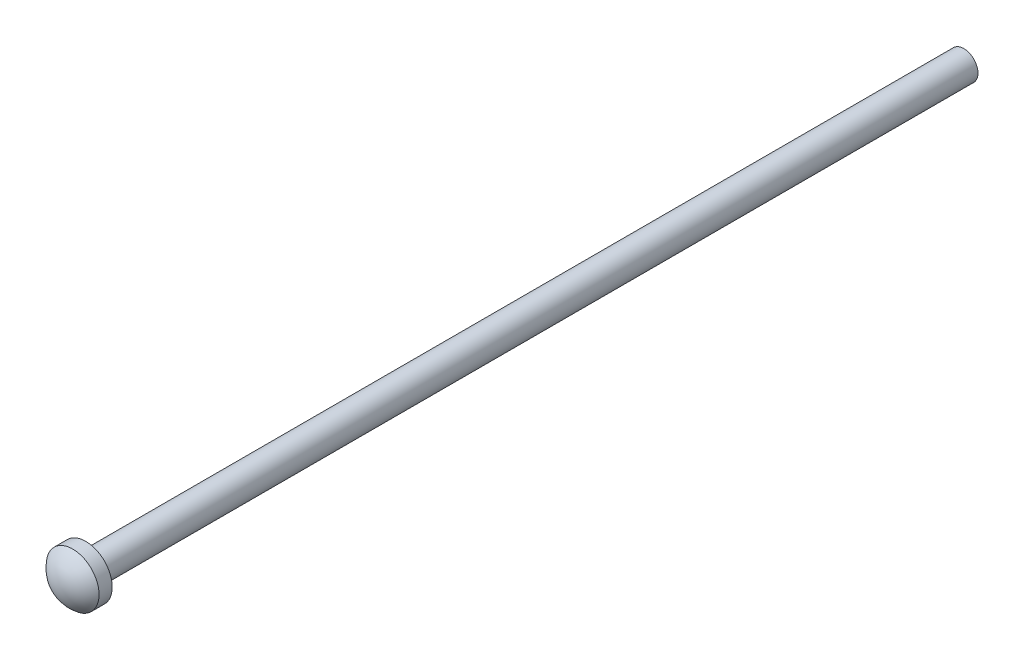
ISO-10303-21;
HEADER;
FILE_DESCRIPTION(('STEP AP214'),'2;1');
FILE_NAME('part.step','',(''),(''),'','','');
FILE_SCHEMA(('AUTOMOTIVE_DESIGN { 1 0 10303 214 1 1 1 1 }'));
ENDSEC;
DATA;
#1=APPLICATION_CONTEXT('core data for automotive mechanical design processes');
#2=APPLICATION_PROTOCOL_DEFINITION('international standard','automotive_design',2000,#1);
#3=PRODUCT_CONTEXT('',#1,'mechanical');
#4=PRODUCT('Part','Part','',(#3));
#5=PRODUCT_RELATED_PRODUCT_CATEGORY('part','',(#4));
#6=PRODUCT_DEFINITION_FORMATION('','',#4);
#7=PRODUCT_DEFINITION_CONTEXT('part definition',#1,'design');
#8=PRODUCT_DEFINITION('design','',#6,#7);
#9=PRODUCT_DEFINITION_SHAPE('','',#8);
#10=(LENGTH_UNIT() NAMED_UNIT(*) SI_UNIT(.MILLI.,.METRE.));
#11=(NAMED_UNIT(*) PLANE_ANGLE_UNIT() SI_UNIT($,.RADIAN.));
#12=(NAMED_UNIT(*) SI_UNIT($,.STERADIAN.) SOLID_ANGLE_UNIT());
#13=UNCERTAINTY_MEASURE_WITH_UNIT(LENGTH_MEASURE(1.E-05),#10,'distance_accuracy_value','');
#14=(GEOMETRIC_REPRESENTATION_CONTEXT(3) GLOBAL_UNCERTAINTY_ASSIGNED_CONTEXT((#13)) GLOBAL_UNIT_ASSIGNED_CONTEXT((#10,
#11,#12)) REPRESENTATION_CONTEXT('',''));
#15=CARTESIAN_POINT('',(0.,0.,0.));
#16=DIRECTION('',(0.,0.,1.));
#17=DIRECTION('',(1.,0.,0.));
#18=AXIS2_PLACEMENT_3D('',#15,#16,#17);
#19=CARTESIAN_POINT('',(0.,60.,-200.));
#20=DIRECTION('',(0.,0.,1.));
#21=DIRECTION('',(1.,0.,0.));
#22=AXIS2_PLACEMENT_3D('',#19,#20,#21);
#23=CYLINDRICAL_SURFACE('',#22,3.25);
#24=CARTESIAN_POINT('',(0.,60.,-200.));
#25=DIRECTION('',(0.,0.,1.));
#26=DIRECTION('',(1.,0.,0.));
#27=AXIS2_PLACEMENT_3D('',#24,#25,#26);
#28=CIRCLE('',#27,3.25);
#29=CARTESIAN_POINT('',(3.25,60.,-200.));
#30=VERTEX_POINT('',#29);
#31=EDGE_CURVE('E10',#30,#30,#28,.T.);
#32=ORIENTED_EDGE('',*,*,#31,.T.);
#33=EDGE_LOOP('',(#32));
#34=FACE_BOUND('',#33,.T.);
#35=CARTESIAN_POINT('',(0.,60.,0.));
#36=DIRECTION('',(0.,0.,1.));
#37=DIRECTION('',(1.,0.,0.));
#38=AXIS2_PLACEMENT_3D('',#35,#36,#37);
#39=CIRCLE('',#38,3.25);
#40=CARTESIAN_POINT('',(3.25,60.,0.));
#41=VERTEX_POINT('',#40);
#42=EDGE_CURVE('E38',#41,#41,#39,.T.);
#43=ORIENTED_EDGE('',*,*,#42,.F.);
#44=EDGE_LOOP('',(#43));
#45=FACE_BOUND('',#44,.T.);
#46=ADVANCED_FACE('F30',(#34,#45),#23,.T.);
#47=CARTESIAN_POINT('',(0.,60.,-200.));
#48=DIRECTION('',(0.,0.,1.));
#49=DIRECTION('',(1.,0.,0.));
#50=AXIS2_PLACEMENT_3D('',#47,#48,#49);
#51=PLANE('',#50);
#52=ORIENTED_EDGE('',*,*,#31,.F.);
#53=EDGE_LOOP('',(#52));
#54=FACE_BOUND('',#53,.T.);
#55=ADVANCED_FACE('F54',(#54),#51,.F.);
#56=CARTESIAN_POINT('',(0.,60.,3.));
#57=DIRECTION('',(0.,0.,-1.));
#58=DIRECTION('',(-1.,0.,0.));
#59=AXIS2_PLACEMENT_3D('',#56,#57,#58);
#60=CYLINDRICAL_SURFACE('',#59,6.);
#61=CARTESIAN_POINT('',(0.,60.,3.));
#62=DIRECTION('',(0.,0.,1.));
#63=DIRECTION('',(1.,0.,0.));
#64=AXIS2_PLACEMENT_3D('',#61,#62,#63);
#65=CIRCLE('',#64,6.);
#66=CARTESIAN_POINT('',(6.,60.,3.));
#67=VERTEX_POINT('',#66);
#68=EDGE_CURVE('E34',#67,#67,#65,.T.);
#69=ORIENTED_EDGE('',*,*,#68,.F.);
#70=EDGE_LOOP('',(#69));
#71=FACE_BOUND('',#70,.T.);
#72=CARTESIAN_POINT('',(0.,60.,0.));
#73=DIRECTION('',(0.,0.,1.));
#74=DIRECTION('',(1.,0.,0.));
#75=AXIS2_PLACEMENT_3D('',#72,#73,#74);
#76=CIRCLE('',#75,6.);
#77=CARTESIAN_POINT('',(6.,60.,0.));
#78=VERTEX_POINT('',#77);
#79=EDGE_CURVE('E44',#78,#78,#76,.T.);
#80=ORIENTED_EDGE('',*,*,#79,.T.);
#81=EDGE_LOOP('',(#80));
#82=FACE_BOUND('',#81,.T.);
#83=ADVANCED_FACE('F52',(#71,#82),#60,.T.);
#84=CARTESIAN_POINT('',(0.,60.,-1.5));
#85=DIRECTION('',(0.,0.,1.));
#86=DIRECTION('',(1.,0.,0.));
#87=AXIS2_PLACEMENT_3D('',#84,#85,#86);
#88=SPHERICAL_SURFACE('',#87,7.5);
#89=ORIENTED_EDGE('',*,*,#68,.T.);
#90=EDGE_LOOP('',(#89));
#91=FACE_BOUND('',#90,.T.);
#92=ADVANCED_FACE('F32',(#91),#88,.T.);
#93=CARTESIAN_POINT('',(0.,60.,0.));
#94=DIRECTION('',(0.,0.,1.));
#95=DIRECTION('',(1.,0.,0.));
#96=AXIS2_PLACEMENT_3D('',#93,#94,#95);
#97=PLANE('',#96);
#98=ORIENTED_EDGE('',*,*,#42,.T.);
#99=EDGE_LOOP('',(#98));
#100=FACE_BOUND('',#99,.T.);
#101=ORIENTED_EDGE('',*,*,#79,.F.);
#102=EDGE_LOOP('',(#101));
#103=FACE_BOUND('',#102,.T.);
#104=ADVANCED_FACE('F60',(#100,#103),#97,.F.);
#105=CLOSED_SHELL('',(#46,#55,#83,#92,#104));
#106=MANIFOLD_SOLID_BREP('B2',#105);
#107=ADVANCED_BREP_SHAPE_REPRESENTATION('',(#18,#106),#14);
#108=SHAPE_DEFINITION_REPRESENTATION(#9,#107);
ENDSEC;
END-ISO-10303-21;
